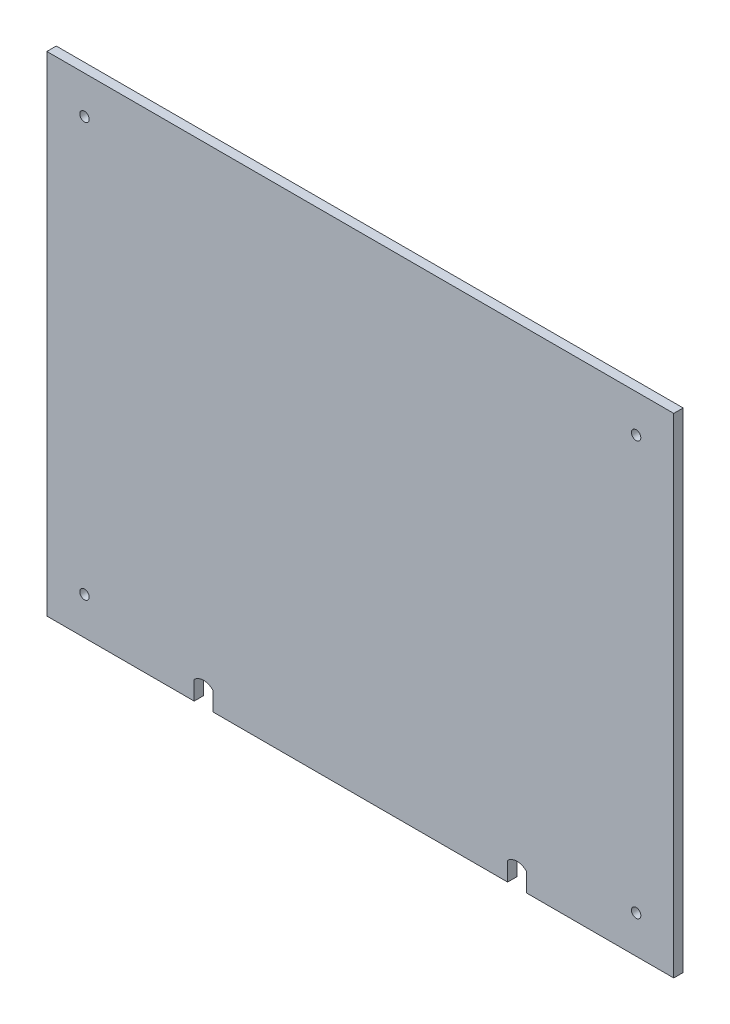
ISO-10303-21;
HEADER;
FILE_DESCRIPTION(('STEP AP214'),'2;1');
FILE_NAME('part.step','',(''),(''),'','','');
FILE_SCHEMA(('AUTOMOTIVE_DESIGN { 1 0 10303 214 1 1 1 1 }'));
ENDSEC;
DATA;
#1=APPLICATION_CONTEXT('core data for automotive mechanical design processes');
#2=APPLICATION_PROTOCOL_DEFINITION('international standard','automotive_design',2000,#1);
#3=PRODUCT_CONTEXT('',#1,'mechanical');
#4=PRODUCT('Part','Part','',(#3));
#5=PRODUCT_RELATED_PRODUCT_CATEGORY('part','',(#4));
#6=PRODUCT_DEFINITION_FORMATION('','',#4);
#7=PRODUCT_DEFINITION_CONTEXT('part definition',#1,'design');
#8=PRODUCT_DEFINITION('design','',#6,#7);
#9=PRODUCT_DEFINITION_SHAPE('','',#8);
#10=(LENGTH_UNIT() NAMED_UNIT(*) SI_UNIT(.MILLI.,.METRE.));
#11=(NAMED_UNIT(*) PLANE_ANGLE_UNIT() SI_UNIT($,.RADIAN.));
#12=(NAMED_UNIT(*) SI_UNIT($,.STERADIAN.) SOLID_ANGLE_UNIT());
#13=UNCERTAINTY_MEASURE_WITH_UNIT(LENGTH_MEASURE(1.E-05),#10,'distance_accuracy_value','');
#14=(GEOMETRIC_REPRESENTATION_CONTEXT(3) GLOBAL_UNCERTAINTY_ASSIGNED_CONTEXT((#13)) GLOBAL_UNIT_ASSIGNED_CONTEXT((#10,
#11,#12)) REPRESENTATION_CONTEXT('',''));
#15=CARTESIAN_POINT('',(0.,0.,0.));
#16=DIRECTION('',(0.,0.,1.));
#17=DIRECTION('',(1.,0.,0.));
#18=AXIS2_PLACEMENT_3D('',#15,#16,#17);
#19=CARTESIAN_POINT('',(0.,0.,3.));
#20=DIRECTION('',(0.,1.,0.));
#21=DIRECTION('',(0.,0.,1.));
#22=AXIS2_PLACEMENT_3D('',#19,#20,#21);
#23=PLANE('',#22);
#24=DIRECTION('',(1.,0.,0.));
#25=VECTOR('',#24,1.);
#26=CARTESIAN_POINT('',(0.,0.,3.));
#27=LINE('',#26,#25);
#28=CARTESIAN_POINT('',(153.,0.,3.));
#29=VERTEX_POINT('',#28);
#30=CARTESIAN_POINT('',(200.,0.,3.));
#31=VERTEX_POINT('',#30);
#32=EDGE_CURVE('E185',#29,#31,#27,.T.);
#33=ORIENTED_EDGE('',*,*,#32,.F.);
#34=DIRECTION('',(0.,0.,1.));
#35=VECTOR('',#34,1.);
#36=CARTESIAN_POINT('',(153.,0.,-7.));
#37=LINE('',#36,#35);
#38=CARTESIAN_POINT('',(153.,0.,0.));
#39=VERTEX_POINT('',#38);
#40=EDGE_CURVE('E150',#39,#29,#37,.T.);
#41=ORIENTED_EDGE('',*,*,#40,.F.);
#42=DIRECTION('',(1.,0.,0.));
#43=VECTOR('',#42,1.);
#44=CARTESIAN_POINT('',(0.,0.,0.));
#45=LINE('',#44,#43);
#46=CARTESIAN_POINT('',(200.,0.,0.));
#47=VERTEX_POINT('',#46);
#48=EDGE_CURVE('E198',#39,#47,#45,.T.);
#49=ORIENTED_EDGE('',*,*,#48,.T.);
#50=DIRECTION('',(0.,0.,-1.));
#51=VECTOR('',#50,1.);
#52=CARTESIAN_POINT('',(200.,0.,3.));
#53=LINE('',#52,#51);
#54=EDGE_CURVE('E211',#31,#47,#53,.T.);
#55=ORIENTED_EDGE('',*,*,#54,.F.);
#56=EDGE_LOOP('',(#33,#41,#49,#55));
#57=FACE_BOUND('',#56,.T.);
#58=ADVANCED_FACE('F33',(#57),#23,.F.);
#59=CARTESIAN_POINT('',(0.,0.,0.));
#60=VERTEX_POINT('',#59);
#61=CARTESIAN_POINT('',(47.,0.,0.));
#62=VERTEX_POINT('',#61);
#63=EDGE_CURVE('E199',#60,#62,#45,.T.);
#64=ORIENTED_EDGE('',*,*,#63,.T.);
#65=DIRECTION('',(0.,0.,1.));
#66=VECTOR('',#65,1.);
#67=CARTESIAN_POINT('',(47.,0.,-7.));
#68=LINE('',#67,#66);
#69=CARTESIAN_POINT('',(47.,0.,3.));
#70=VERTEX_POINT('',#69);
#71=EDGE_CURVE('E160',#62,#70,#68,.T.);
#72=ORIENTED_EDGE('',*,*,#71,.T.);
#73=CARTESIAN_POINT('',(0.,0.,3.));
#74=VERTEX_POINT('',#73);
#75=EDGE_CURVE('E187',#74,#70,#27,.T.);
#76=ORIENTED_EDGE('',*,*,#75,.F.);
#77=DIRECTION('',(0.,0.,-1.));
#78=VECTOR('',#77,1.);
#79=CARTESIAN_POINT('',(0.,0.,3.));
#80=LINE('',#79,#78);
#81=EDGE_CURVE('E214',#74,#60,#80,.T.);
#82=ORIENTED_EDGE('',*,*,#81,.T.);
#83=EDGE_LOOP('',(#64,#72,#76,#82));
#84=FACE_BOUND('',#83,.T.);
#85=ADVANCED_FACE('F261',(#84),#23,.F.);
#86=CARTESIAN_POINT('',(0.,156.,3.));
#87=DIRECTION('',(1.,0.,0.));
#88=DIRECTION('',(0.,1.,0.));
#89=AXIS2_PLACEMENT_3D('',#86,#87,#88);
#90=PLANE('',#89);
#91=DIRECTION('',(0.,-1.,0.));
#92=VECTOR('',#91,1.);
#93=CARTESIAN_POINT('',(0.,156.,0.));
#94=LINE('',#93,#92);
#95=CARTESIAN_POINT('',(0.,156.,0.));
#96=VERTEX_POINT('',#95);
#97=EDGE_CURVE('E195',#96,#60,#94,.T.);
#98=ORIENTED_EDGE('',*,*,#97,.T.);
#99=ORIENTED_EDGE('',*,*,#81,.F.);
#100=DIRECTION('',(0.,-1.,0.));
#101=VECTOR('',#100,1.);
#102=CARTESIAN_POINT('',(0.,156.,3.));
#103=LINE('',#102,#101);
#104=CARTESIAN_POINT('',(0.,156.,3.));
#105=VERTEX_POINT('',#104);
#106=EDGE_CURVE('E182',#105,#74,#103,.T.);
#107=ORIENTED_EDGE('',*,*,#106,.F.);
#108=DIRECTION('',(0.,0.,-1.));
#109=VECTOR('',#108,1.);
#110=CARTESIAN_POINT('',(0.,156.,3.));
#111=LINE('',#110,#109);
#112=EDGE_CURVE('E194',#105,#96,#111,.T.);
#113=ORIENTED_EDGE('',*,*,#112,.T.);
#114=EDGE_LOOP('',(#98,#99,#107,#113));
#115=FACE_BOUND('',#114,.T.);
#116=ADVANCED_FACE('F35',(#115),#90,.F.);
#117=CARTESIAN_POINT('',(53.,0.,0.));
#118=VERTEX_POINT('',#117);
#119=CARTESIAN_POINT('',(147.,0.,0.));
#120=VERTEX_POINT('',#119);
#121=EDGE_CURVE('E203',#118,#120,#45,.T.);
#122=ORIENTED_EDGE('',*,*,#121,.T.);
#123=DIRECTION('',(0.,0.,1.));
#124=VECTOR('',#123,1.);
#125=CARTESIAN_POINT('',(147.,0.,-7.));
#126=LINE('',#125,#124);
#127=CARTESIAN_POINT('',(147.,0.,3.));
#128=VERTEX_POINT('',#127);
#129=EDGE_CURVE('E48',#120,#128,#126,.T.);
#130=ORIENTED_EDGE('',*,*,#129,.T.);
#131=CARTESIAN_POINT('',(53.,0.,3.));
#132=VERTEX_POINT('',#131);
#133=EDGE_CURVE('E144',#132,#128,#27,.T.);
#134=ORIENTED_EDGE('',*,*,#133,.F.);
#135=DIRECTION('',(0.,0.,1.));
#136=VECTOR('',#135,1.);
#137=CARTESIAN_POINT('',(53.,0.,-7.));
#138=LINE('',#137,#136);
#139=EDGE_CURVE('E159',#118,#132,#138,.T.);
#140=ORIENTED_EDGE('',*,*,#139,.F.);
#141=EDGE_LOOP('',(#122,#130,#134,#140));
#142=FACE_BOUND('',#141,.T.);
#143=ADVANCED_FACE('F272',(#142),#23,.F.);
#144=CARTESIAN_POINT('',(200.,0.,3.));
#145=DIRECTION('',(-1.,0.,0.));
#146=DIRECTION('',(0.,0.,1.));
#147=AXIS2_PLACEMENT_3D('',#144,#145,#146);
#148=PLANE('',#147);
#149=DIRECTION('',(0.,1.,0.));
#150=VECTOR('',#149,1.);
#151=CARTESIAN_POINT('',(200.,0.,0.));
#152=LINE('',#151,#150);
#153=CARTESIAN_POINT('',(200.,156.,0.));
#154=VERTEX_POINT('',#153);
#155=EDGE_CURVE('E202',#47,#154,#152,.T.);
#156=ORIENTED_EDGE('',*,*,#155,.T.);
#157=DIRECTION('',(0.,0.,-1.));
#158=VECTOR('',#157,1.);
#159=CARTESIAN_POINT('',(200.,156.,3.));
#160=LINE('',#159,#158);
#161=CARTESIAN_POINT('',(200.,156.,3.));
#162=VERTEX_POINT('',#161);
#163=EDGE_CURVE('E208',#162,#154,#160,.T.);
#164=ORIENTED_EDGE('',*,*,#163,.F.);
#165=DIRECTION('',(0.,1.,0.));
#166=VECTOR('',#165,1.);
#167=CARTESIAN_POINT('',(200.,0.,3.));
#168=LINE('',#167,#166);
#169=EDGE_CURVE('E190',#31,#162,#168,.T.);
#170=ORIENTED_EDGE('',*,*,#169,.F.);
#171=ORIENTED_EDGE('',*,*,#54,.T.);
#172=EDGE_LOOP('',(#156,#164,#170,#171));
#173=FACE_BOUND('',#172,.T.);
#174=ADVANCED_FACE('F250',(#173),#148,.F.);
#175=CARTESIAN_POINT('',(200.,156.,3.));
#176=DIRECTION('',(0.,-1.,0.));
#177=DIRECTION('',(1.,0.,0.));
#178=AXIS2_PLACEMENT_3D('',#175,#176,#177);
#179=PLANE('',#178);
#180=DIRECTION('',(-1.,0.,0.));
#181=VECTOR('',#180,1.);
#182=CARTESIAN_POINT('',(200.,156.,0.));
#183=LINE('',#182,#181);
#184=EDGE_CURVE('E186',#154,#96,#183,.T.);
#185=ORIENTED_EDGE('',*,*,#184,.T.);
#186=ORIENTED_EDGE('',*,*,#112,.F.);
#187=DIRECTION('',(-1.,0.,0.));
#188=VECTOR('',#187,1.);
#189=CARTESIAN_POINT('',(200.,156.,3.));
#190=LINE('',#189,#188);
#191=EDGE_CURVE('E192',#162,#105,#190,.T.);
#192=ORIENTED_EDGE('',*,*,#191,.F.);
#193=ORIENTED_EDGE('',*,*,#163,.T.);
#194=EDGE_LOOP('',(#185,#186,#192,#193));
#195=FACE_BOUND('',#194,.T.);
#196=ADVANCED_FACE('F256',(#195),#179,.F.);
#197=CARTESIAN_POINT('',(0.,0.,3.));
#198=DIRECTION('',(0.,0.,1.));
#199=DIRECTION('',(1.,0.,0.));
#200=AXIS2_PLACEMENT_3D('',#197,#198,#199);
#201=PLANE('',#200);
#202=DIRECTION('',(0.,1.,0.));
#203=VECTOR('',#202,1.);
#204=CARTESIAN_POINT('',(153.,6.,3.));
#205=LINE('',#204,#203);
#206=CARTESIAN_POINT('',(153.,6.,3.));
#207=VERTEX_POINT('',#206);
#208=EDGE_CURVE('E128',#29,#207,#205,.T.);
#209=ORIENTED_EDGE('',*,*,#208,.F.);
#210=ORIENTED_EDGE('',*,*,#32,.T.);
#211=ORIENTED_EDGE('',*,*,#169,.T.);
#212=ORIENTED_EDGE('',*,*,#191,.T.);
#213=ORIENTED_EDGE('',*,*,#106,.T.);
#214=ORIENTED_EDGE('',*,*,#75,.T.);
#215=DIRECTION('',(0.,-1.,0.));
#216=VECTOR('',#215,1.);
#217=CARTESIAN_POINT('',(47.,6.,3.));
#218=LINE('',#217,#216);
#219=CARTESIAN_POINT('',(47.,6.00000000000001,3.));
#220=VERTEX_POINT('',#219);
#221=EDGE_CURVE('E157',#220,#70,#218,.T.);
#222=ORIENTED_EDGE('',*,*,#221,.F.);
#223=CARTESIAN_POINT('',(50.,3.,3.));
#224=DIRECTION('',(0.,0.,1.));
#225=DIRECTION('',(1.,0.,0.));
#226=AXIS2_PLACEMENT_3D('',#223,#224,#225);
#227=CIRCLE('',#226,4.24264068711929);
#228=CARTESIAN_POINT('',(53.,6.,3.));
#229=VERTEX_POINT('',#228);
#230=EDGE_CURVE('E154',#229,#220,#227,.T.);
#231=ORIENTED_EDGE('',*,*,#230,.F.);
#232=DIRECTION('',(0.,1.,0.));
#233=VECTOR('',#232,1.);
#234=CARTESIAN_POINT('',(53.,0.,3.));
#235=LINE('',#234,#233);
#236=EDGE_CURVE('E149',#132,#229,#235,.T.);
#237=ORIENTED_EDGE('',*,*,#236,.F.);
#238=ORIENTED_EDGE('',*,*,#133,.T.);
#239=DIRECTION('',(0.,-1.,0.));
#240=VECTOR('',#239,1.);
#241=CARTESIAN_POINT('',(147.,0.,3.));
#242=LINE('',#241,#240);
#243=CARTESIAN_POINT('',(147.,6.,3.));
#244=VERTEX_POINT('',#243);
#245=EDGE_CURVE('E124',#244,#128,#242,.T.);
#246=ORIENTED_EDGE('',*,*,#245,.F.);
#247=CARTESIAN_POINT('',(150.,3.,3.));
#248=DIRECTION('',(0.,0.,1.));
#249=DIRECTION('',(-1.,0.,0.));
#250=AXIS2_PLACEMENT_3D('',#247,#248,#249);
#251=CIRCLE('',#250,4.24264068711928);
#252=EDGE_CURVE('E131',#207,#244,#251,.T.);
#253=ORIENTED_EDGE('',*,*,#252,.F.);
#254=EDGE_LOOP('',(#209,#210,#211,#212,#213,#214,#222,#231,#237,#238,#246,#253));
#255=FACE_BOUND('',#254,.T.);
#256=CARTESIAN_POINT('',(12.,144.,3.));
#257=DIRECTION('',(0.,0.,1.));
#258=DIRECTION('',(-1.,0.,0.));
#259=AXIS2_PLACEMENT_3D('',#256,#257,#258);
#260=CIRCLE('',#259,1.5);
#261=CARTESIAN_POINT('',(10.5,144.,3.));
#262=VERTEX_POINT('',#261);
#263=EDGE_CURVE('E163',#262,#262,#260,.T.);
#264=ORIENTED_EDGE('',*,*,#263,.F.);
#265=EDGE_LOOP('',(#264));
#266=FACE_BOUND('',#265,.T.);
#267=CARTESIAN_POINT('',(188.,12.0000000000001,3.));
#268=DIRECTION('',(0.,0.,1.));
#269=DIRECTION('',(-1.,0.,0.));
#270=AXIS2_PLACEMENT_3D('',#267,#268,#269);
#271=CIRCLE('',#270,1.50000000000002);
#272=CARTESIAN_POINT('',(186.5,12.0000000000001,3.));
#273=VERTEX_POINT('',#272);
#274=EDGE_CURVE('E168',#273,#273,#271,.T.);
#275=ORIENTED_EDGE('',*,*,#274,.F.);
#276=EDGE_LOOP('',(#275));
#277=FACE_BOUND('',#276,.T.);
#278=CARTESIAN_POINT('',(188.,144.,3.));
#279=DIRECTION('',(0.,0.,1.));
#280=DIRECTION('',(1.,0.,0.));
#281=AXIS2_PLACEMENT_3D('',#278,#279,#280);
#282=CIRCLE('',#281,1.50000000000002);
#283=CARTESIAN_POINT('',(189.5,144.,3.));
#284=VERTEX_POINT('',#283);
#285=EDGE_CURVE('E171',#284,#284,#282,.T.);
#286=ORIENTED_EDGE('',*,*,#285,.F.);
#287=EDGE_LOOP('',(#286));
#288=FACE_BOUND('',#287,.T.);
#289=CARTESIAN_POINT('',(12.,12.,3.));
#290=DIRECTION('',(0.,0.,1.));
#291=DIRECTION('',(1.,0.,0.));
#292=AXIS2_PLACEMENT_3D('',#289,#290,#291);
#293=CIRCLE('',#292,1.5);
#294=CARTESIAN_POINT('',(13.5,12.,3.));
#295=VERTEX_POINT('',#294);
#296=EDGE_CURVE('E177',#295,#295,#293,.T.);
#297=ORIENTED_EDGE('',*,*,#296,.F.);
#298=EDGE_LOOP('',(#297));
#299=FACE_BOUND('',#298,.T.);
#300=ADVANCED_FACE('F140',(#255,#266,#277,#288,#299),#201,.T.);
#301=CARTESIAN_POINT('',(0.,0.,0.));
#302=DIRECTION('',(0.,0.,1.));
#303=DIRECTION('',(1.,0.,0.));
#304=AXIS2_PLACEMENT_3D('',#301,#302,#303);
#305=PLANE('',#304);
#306=CARTESIAN_POINT('',(12.,144.,0.));
#307=DIRECTION('',(0.,0.,1.));
#308=DIRECTION('',(1.,0.,0.));
#309=AXIS2_PLACEMENT_3D('',#306,#307,#308);
#310=CIRCLE('',#309,1.5);
#311=CARTESIAN_POINT('',(13.5,144.,0.));
#312=VERTEX_POINT('',#311);
#313=EDGE_CURVE('E181',#312,#312,#310,.T.);
#314=ORIENTED_EDGE('',*,*,#313,.T.);
#315=EDGE_LOOP('',(#314));
#316=FACE_BOUND('',#315,.T.);
#317=CARTESIAN_POINT('',(188.,12.0000000000001,0.));
#318=DIRECTION('',(0.,0.,1.));
#319=DIRECTION('',(1.,0.,0.));
#320=AXIS2_PLACEMENT_3D('',#317,#318,#319);
#321=CIRCLE('',#320,1.50000000000002);
#322=CARTESIAN_POINT('',(189.5,12.0000000000001,0.));
#323=VERTEX_POINT('',#322);
#324=EDGE_CURVE('E222',#323,#323,#321,.T.);
#325=ORIENTED_EDGE('',*,*,#324,.T.);
#326=EDGE_LOOP('',(#325));
#327=FACE_BOUND('',#326,.T.);
#328=CARTESIAN_POINT('',(188.,144.,0.));
#329=DIRECTION('',(0.,0.,1.));
#330=DIRECTION('',(1.,0.,0.));
#331=AXIS2_PLACEMENT_3D('',#328,#329,#330);
#332=CIRCLE('',#331,1.50000000000002);
#333=CARTESIAN_POINT('',(189.5,144.,0.));
#334=VERTEX_POINT('',#333);
#335=EDGE_CURVE('E176',#334,#334,#332,.T.);
#336=ORIENTED_EDGE('',*,*,#335,.T.);
#337=EDGE_LOOP('',(#336));
#338=FACE_BOUND('',#337,.T.);
#339=CARTESIAN_POINT('',(12.,12.,0.));
#340=DIRECTION('',(0.,0.,1.));
#341=DIRECTION('',(1.,0.,0.));
#342=AXIS2_PLACEMENT_3D('',#339,#340,#341);
#343=CIRCLE('',#342,1.5);
#344=CARTESIAN_POINT('',(13.5,12.,0.));
#345=VERTEX_POINT('',#344);
#346=EDGE_CURVE('E180',#345,#345,#343,.T.);
#347=ORIENTED_EDGE('',*,*,#346,.T.);
#348=EDGE_LOOP('',(#347));
#349=FACE_BOUND('',#348,.T.);
#350=ORIENTED_EDGE('',*,*,#48,.F.);
#351=DIRECTION('',(0.,1.,0.));
#352=VECTOR('',#351,1.);
#353=CARTESIAN_POINT('',(153.,0.,0.));
#354=LINE('',#353,#352);
#355=CARTESIAN_POINT('',(153.,6.,0.));
#356=VERTEX_POINT('',#355);
#357=EDGE_CURVE('E11',#39,#356,#354,.T.);
#358=ORIENTED_EDGE('',*,*,#357,.T.);
#359=CARTESIAN_POINT('',(150.,3.,0.));
#360=DIRECTION('',(0.,0.,1.));
#361=DIRECTION('',(1.,0.,0.));
#362=AXIS2_PLACEMENT_3D('',#359,#360,#361);
#363=CIRCLE('',#362,4.24264068711928);
#364=CARTESIAN_POINT('',(147.,6.,0.));
#365=VERTEX_POINT('',#364);
#366=EDGE_CURVE('E41',#356,#365,#363,.T.);
#367=ORIENTED_EDGE('',*,*,#366,.T.);
#368=DIRECTION('',(0.,-1.,0.));
#369=VECTOR('',#368,1.);
#370=CARTESIAN_POINT('',(147.,0.,0.));
#371=LINE('',#370,#369);
#372=EDGE_CURVE('E125',#365,#120,#371,.T.);
#373=ORIENTED_EDGE('',*,*,#372,.T.);
#374=ORIENTED_EDGE('',*,*,#121,.F.);
#375=DIRECTION('',(0.,1.,0.));
#376=VECTOR('',#375,1.);
#377=CARTESIAN_POINT('',(53.,0.,0.));
#378=LINE('',#377,#376);
#379=CARTESIAN_POINT('',(53.,6.,0.));
#380=VERTEX_POINT('',#379);
#381=EDGE_CURVE('E217',#118,#380,#378,.T.);
#382=ORIENTED_EDGE('',*,*,#381,.T.);
#383=CARTESIAN_POINT('',(50.,3.,0.));
#384=DIRECTION('',(0.,0.,1.));
#385=DIRECTION('',(1.,0.,0.));
#386=AXIS2_PLACEMENT_3D('',#383,#384,#385);
#387=CIRCLE('',#386,4.24264068711929);
#388=CARTESIAN_POINT('',(47.,6.00000000000001,0.));
#389=VERTEX_POINT('',#388);
#390=EDGE_CURVE('E229',#380,#389,#387,.T.);
#391=ORIENTED_EDGE('',*,*,#390,.T.);
#392=DIRECTION('',(0.,-1.,0.));
#393=VECTOR('',#392,1.);
#394=CARTESIAN_POINT('',(47.,0.,0.));
#395=LINE('',#394,#393);
#396=EDGE_CURVE('E232',#389,#62,#395,.T.);
#397=ORIENTED_EDGE('',*,*,#396,.T.);
#398=ORIENTED_EDGE('',*,*,#63,.F.);
#399=ORIENTED_EDGE('',*,*,#97,.F.);
#400=ORIENTED_EDGE('',*,*,#184,.F.);
#401=ORIENTED_EDGE('',*,*,#155,.F.);
#402=EDGE_LOOP('',(#350,#358,#367,#373,#374,#382,#391,#397,#398,#399,#400,#401));
#403=FACE_BOUND('',#402,.T.);
#404=ADVANCED_FACE('F237',(#316,#327,#338,#349,#403),#305,.F.);
#405=CARTESIAN_POINT('',(12.,12.,-14.));
#406=DIRECTION('',(0.,0.,1.));
#407=DIRECTION('',(1.,0.,0.));
#408=AXIS2_PLACEMENT_3D('',#405,#406,#407);
#409=CYLINDRICAL_SURFACE('',#408,1.5);
#410=ORIENTED_EDGE('',*,*,#296,.T.);
#411=EDGE_LOOP('',(#410));
#412=FACE_BOUND('',#411,.T.);
#413=ORIENTED_EDGE('',*,*,#346,.F.);
#414=EDGE_LOOP('',(#413));
#415=FACE_BOUND('',#414,.T.);
#416=ADVANCED_FACE('F311',(#412,#415),#409,.F.);
#417=CARTESIAN_POINT('',(188.,144.,-14.));
#418=DIRECTION('',(0.,0.,1.));
#419=DIRECTION('',(1.,0.,0.));
#420=AXIS2_PLACEMENT_3D('',#417,#418,#419);
#421=CYLINDRICAL_SURFACE('',#420,1.50000000000002);
#422=ORIENTED_EDGE('',*,*,#285,.T.);
#423=EDGE_LOOP('',(#422));
#424=FACE_BOUND('',#423,.T.);
#425=ORIENTED_EDGE('',*,*,#335,.F.);
#426=EDGE_LOOP('',(#425));
#427=FACE_BOUND('',#426,.T.);
#428=ADVANCED_FACE('F316',(#424,#427),#421,.F.);
#429=CARTESIAN_POINT('',(188.,12.0000000000001,-14.));
#430=DIRECTION('',(0.,0.,1.));
#431=DIRECTION('',(1.,0.,0.));
#432=AXIS2_PLACEMENT_3D('',#429,#430,#431);
#433=CYLINDRICAL_SURFACE('',#432,1.50000000000002);
#434=ORIENTED_EDGE('',*,*,#274,.T.);
#435=EDGE_LOOP('',(#434));
#436=FACE_BOUND('',#435,.T.);
#437=ORIENTED_EDGE('',*,*,#324,.F.);
#438=EDGE_LOOP('',(#437));
#439=FACE_BOUND('',#438,.T.);
#440=ADVANCED_FACE('F328',(#436,#439),#433,.F.);
#441=CARTESIAN_POINT('',(12.,144.,-14.));
#442=DIRECTION('',(0.,0.,1.));
#443=DIRECTION('',(1.,0.,0.));
#444=AXIS2_PLACEMENT_3D('',#441,#442,#443);
#445=CYLINDRICAL_SURFACE('',#444,1.5);
#446=ORIENTED_EDGE('',*,*,#263,.T.);
#447=EDGE_LOOP('',(#446));
#448=FACE_BOUND('',#447,.T.);
#449=ORIENTED_EDGE('',*,*,#313,.F.);
#450=EDGE_LOOP('',(#449));
#451=FACE_BOUND('',#450,.T.);
#452=ADVANCED_FACE('F338',(#448,#451),#445,.F.);
#453=CARTESIAN_POINT('',(47.,6.,-7.));
#454=DIRECTION('',(-1.,0.,0.));
#455=DIRECTION('',(0.,0.,1.));
#456=AXIS2_PLACEMENT_3D('',#453,#454,#455);
#457=PLANE('',#456);
#458=DIRECTION('',(0.,0.,1.));
#459=VECTOR('',#458,1.);
#460=CARTESIAN_POINT('',(47.,6.00000000000001,-7.));
#461=LINE('',#460,#459);
#462=EDGE_CURVE('E164',#389,#220,#461,.T.);
#463=ORIENTED_EDGE('',*,*,#462,.T.);
#464=ORIENTED_EDGE('',*,*,#221,.T.);
#465=ORIENTED_EDGE('',*,*,#71,.F.);
#466=ORIENTED_EDGE('',*,*,#396,.F.);
#467=EDGE_LOOP('',(#463,#464,#465,#466));
#468=FACE_BOUND('',#467,.T.);
#469=ADVANCED_FACE('F265',(#468),#457,.F.);
#470=CARTESIAN_POINT('',(50.,3.,-7.));
#471=DIRECTION('',(0.,0.,1.));
#472=DIRECTION('',(1.,0.,0.));
#473=AXIS2_PLACEMENT_3D('',#470,#471,#472);
#474=CYLINDRICAL_SURFACE('',#473,4.24264068711929);
#475=DIRECTION('',(0.,0.,1.));
#476=VECTOR('',#475,1.);
#477=CARTESIAN_POINT('',(53.,6.,-7.));
#478=LINE('',#477,#476);
#479=EDGE_CURVE('E56',#380,#229,#478,.T.);
#480=ORIENTED_EDGE('',*,*,#479,.T.);
#481=ORIENTED_EDGE('',*,*,#230,.T.);
#482=ORIENTED_EDGE('',*,*,#462,.F.);
#483=ORIENTED_EDGE('',*,*,#390,.F.);
#484=EDGE_LOOP('',(#480,#481,#482,#483));
#485=FACE_BOUND('',#484,.T.);
#486=ADVANCED_FACE('F268',(#485),#474,.F.);
#487=CARTESIAN_POINT('',(53.,0.,-7.));
#488=DIRECTION('',(1.,0.,0.));
#489=DIRECTION('',(0.,0.,-1.));
#490=AXIS2_PLACEMENT_3D('',#487,#488,#489);
#491=PLANE('',#490);
#492=ORIENTED_EDGE('',*,*,#139,.T.);
#493=ORIENTED_EDGE('',*,*,#236,.T.);
#494=ORIENTED_EDGE('',*,*,#479,.F.);
#495=ORIENTED_EDGE('',*,*,#381,.F.);
#496=EDGE_LOOP('',(#492,#493,#494,#495));
#497=FACE_BOUND('',#496,.T.);
#498=ADVANCED_FACE('F269',(#497),#491,.F.);
#499=CARTESIAN_POINT('',(150.,3.,-7.));
#500=DIRECTION('',(0.,0.,1.));
#501=DIRECTION('',(1.,0.,0.));
#502=AXIS2_PLACEMENT_3D('',#499,#500,#501);
#503=CYLINDRICAL_SURFACE('',#502,4.24264068711928);
#504=DIRECTION('',(0.,0.,1.));
#505=VECTOR('',#504,1.);
#506=CARTESIAN_POINT('',(153.,6.,-7.));
#507=LINE('',#506,#505);
#508=EDGE_CURVE('E134',#356,#207,#507,.T.);
#509=ORIENTED_EDGE('',*,*,#508,.T.);
#510=ORIENTED_EDGE('',*,*,#252,.T.);
#511=DIRECTION('',(0.,0.,1.));
#512=VECTOR('',#511,1.);
#513=CARTESIAN_POINT('',(147.,6.,-7.));
#514=LINE('',#513,#512);
#515=EDGE_CURVE('E120',#365,#244,#514,.T.);
#516=ORIENTED_EDGE('',*,*,#515,.F.);
#517=ORIENTED_EDGE('',*,*,#366,.F.);
#518=EDGE_LOOP('',(#509,#510,#516,#517));
#519=FACE_BOUND('',#518,.T.);
#520=ADVANCED_FACE('F132',(#519),#503,.F.);
#521=CARTESIAN_POINT('',(153.,6.,-7.));
#522=DIRECTION('',(1.,0.,0.));
#523=DIRECTION('',(0.,0.,-1.));
#524=AXIS2_PLACEMENT_3D('',#521,#522,#523);
#525=PLANE('',#524);
#526=ORIENTED_EDGE('',*,*,#40,.T.);
#527=ORIENTED_EDGE('',*,*,#208,.T.);
#528=ORIENTED_EDGE('',*,*,#508,.F.);
#529=ORIENTED_EDGE('',*,*,#357,.F.);
#530=EDGE_LOOP('',(#526,#527,#528,#529));
#531=FACE_BOUND('',#530,.T.);
#532=ADVANCED_FACE('F241',(#531),#525,.F.);
#533=CARTESIAN_POINT('',(147.,0.,-7.));
#534=DIRECTION('',(-1.,0.,0.));
#535=DIRECTION('',(0.,0.,1.));
#536=AXIS2_PLACEMENT_3D('',#533,#534,#535);
#537=PLANE('',#536);
#538=ORIENTED_EDGE('',*,*,#515,.T.);
#539=ORIENTED_EDGE('',*,*,#245,.T.);
#540=ORIENTED_EDGE('',*,*,#129,.F.);
#541=ORIENTED_EDGE('',*,*,#372,.F.);
#542=EDGE_LOOP('',(#538,#539,#540,#541));
#543=FACE_BOUND('',#542,.T.);
#544=ADVANCED_FACE('F122',(#543),#537,.F.);
#545=CLOSED_SHELL('',(#58,#85,#116,#143,#174,#196,#300,#404,#416,#428,#440,#452,#469,#486,#498,
#520,#532,#544));
#546=MANIFOLD_SOLID_BREP('B2',#545);
#547=ADVANCED_BREP_SHAPE_REPRESENTATION('',(#18,#546),#14);
#548=SHAPE_DEFINITION_REPRESENTATION(#9,#547);
ENDSEC;
END-ISO-10303-21;
